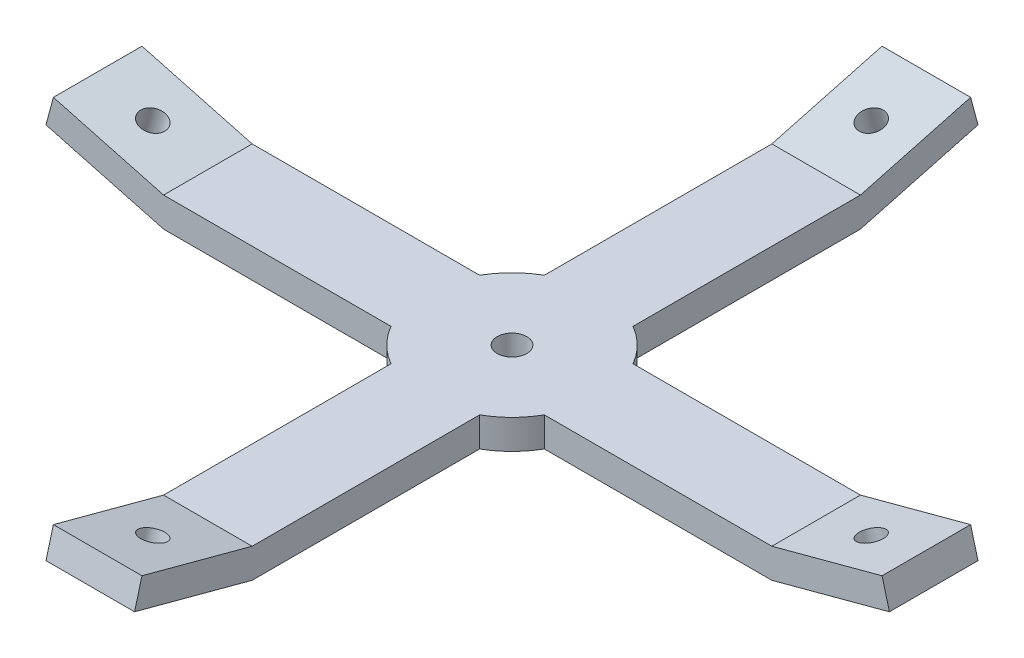
ISO-10303-21;
HEADER;
FILE_DESCRIPTION(('STEP AP214'),'2;1');
FILE_NAME('part.step','',(''),(''),'','','');
FILE_SCHEMA(('AUTOMOTIVE_DESIGN { 1 0 10303 214 1 1 1 1 }'));
ENDSEC;
DATA;
#1=APPLICATION_CONTEXT('core data for automotive mechanical design processes');
#2=APPLICATION_PROTOCOL_DEFINITION('international standard','automotive_design',2000,#1);
#3=PRODUCT_CONTEXT('',#1,'mechanical');
#4=PRODUCT('Part','Part','',(#3));
#5=PRODUCT_RELATED_PRODUCT_CATEGORY('part','',(#4));
#6=PRODUCT_DEFINITION_FORMATION('','',#4);
#7=PRODUCT_DEFINITION_CONTEXT('part definition',#1,'design');
#8=PRODUCT_DEFINITION('design','',#6,#7);
#9=PRODUCT_DEFINITION_SHAPE('','',#8);
#10=(LENGTH_UNIT() NAMED_UNIT(*) SI_UNIT(.MILLI.,.METRE.));
#11=(NAMED_UNIT(*) PLANE_ANGLE_UNIT() SI_UNIT($,.RADIAN.));
#12=(NAMED_UNIT(*) SI_UNIT($,.STERADIAN.) SOLID_ANGLE_UNIT());
#13=UNCERTAINTY_MEASURE_WITH_UNIT(LENGTH_MEASURE(1.E-05),#10,'distance_accuracy_value','');
#14=(GEOMETRIC_REPRESENTATION_CONTEXT(3) GLOBAL_UNCERTAINTY_ASSIGNED_CONTEXT((#13)) GLOBAL_UNIT_ASSIGNED_CONTEXT((#10,
#11,#12)) REPRESENTATION_CONTEXT('',''));
#15=CARTESIAN_POINT('',(0.,0.,0.));
#16=DIRECTION('',(0.,0.,1.));
#17=DIRECTION('',(1.,0.,0.));
#18=AXIS2_PLACEMENT_3D('',#15,#16,#17);
#19=CARTESIAN_POINT('',(-7.5,5.,-51.5));
#20=DIRECTION('',(1.,0.,0.));
#21=DIRECTION('',(0.,0.,-1.));
#22=AXIS2_PLACEMENT_3D('',#19,#20,#21);
#23=PLANE('',#22);
#24=DIRECTION('',(0.,0.,1.));
#25=VECTOR('',#24,1.);
#26=CARTESIAN_POINT('',(-7.5,0.,-51.5));
#27=LINE('',#26,#25);
#28=CARTESIAN_POINT('',(-7.5,0.,-51.5));
#29=VERTEX_POINT('',#28);
#30=CARTESIAN_POINT('',(-7.49999999999999,0.,-12.9903810567666));
#31=VERTEX_POINT('',#30);
#32=EDGE_CURVE('E101',#29,#31,#27,.T.);
#33=ORIENTED_EDGE('',*,*,#32,.T.);
#34=DIRECTION('',(0.,-1.,0.));
#35=VECTOR('',#34,1.);
#36=CARTESIAN_POINT('',(-7.49999999999999,5.,-12.9903810567666));
#37=LINE('',#36,#35);
#38=CARTESIAN_POINT('',(-7.49999999999999,5.,-12.9903810567666));
#39=VERTEX_POINT('',#38);
#40=EDGE_CURVE('E11',#39,#31,#37,.T.);
#41=ORIENTED_EDGE('',*,*,#40,.F.);
#42=DIRECTION('',(0.,0.,1.));
#43=VECTOR('',#42,1.);
#44=CARTESIAN_POINT('',(-7.5,5.,-51.5));
#45=LINE('',#44,#43);
#46=CARTESIAN_POINT('',(-7.5,5.,-51.5));
#47=VERTEX_POINT('',#46);
#48=EDGE_CURVE('E209',#47,#39,#45,.T.);
#49=ORIENTED_EDGE('',*,*,#48,.F.);
#50=DIRECTION('',(0.,0.258819045102515,-0.96592582628907));
#51=VECTOR('',#50,1.);
#52=CARTESIAN_POINT('',(-7.50000000000001,10.,-70.1602540378449));
#53=LINE('',#52,#51);
#54=CARTESIAN_POINT('',(-7.50000000000001,10.,-70.1602540378449));
#55=VERTEX_POINT('',#54);
#56=EDGE_CURVE('E267',#47,#55,#53,.T.);
#57=ORIENTED_EDGE('',*,*,#56,.T.);
#58=DIRECTION('',(0.,-0.965925826289068,-0.25881904510252));
#59=VECTOR('',#58,1.);
#60=CARTESIAN_POINT('',(-7.50000000000001,10.,-70.1602540378449));
#61=LINE('',#60,#59);
#62=CARTESIAN_POINT('',(-7.50000000000001,5.33493649053889,-71.4102540378449));
#63=VERTEX_POINT('',#62);
#64=EDGE_CURVE('E282',#55,#63,#61,.T.);
#65=ORIENTED_EDGE('',*,*,#64,.T.);
#66=DIRECTION('',(0.,-0.258819045102514,0.96592582628907));
#67=VECTOR('',#66,1.);
#68=CARTESIAN_POINT('',(-7.5,0.,-51.5));
#69=LINE('',#68,#67);
#70=EDGE_CURVE('E273',#63,#29,#69,.T.);
#71=ORIENTED_EDGE('',*,*,#70,.T.);
#72=EDGE_LOOP('',(#33,#41,#49,#57,#65,#71));
#73=FACE_BOUND('',#72,.T.);
#74=ADVANCED_FACE('F35',(#73),#23,.F.);
#75=CARTESIAN_POINT('',(0.,5.,0.));
#76=DIRECTION('',(0.,-1.,0.));
#77=DIRECTION('',(0.,0.,-1.));
#78=AXIS2_PLACEMENT_3D('',#75,#76,#77);
#79=CYLINDRICAL_SURFACE('',#78,15.);
#80=CARTESIAN_POINT('',(0.,0.,0.));
#81=DIRECTION('',(0.,1.,0.));
#82=DIRECTION('',(0.,0.,1.));
#83=AXIS2_PLACEMENT_3D('',#80,#81,#82);
#84=CIRCLE('',#83,15.);
#85=CARTESIAN_POINT('',(-12.9903810567666,0.,-7.49999999999993));
#86=VERTEX_POINT('',#85);
#87=EDGE_CURVE('E174',#31,#86,#84,.T.);
#88=ORIENTED_EDGE('',*,*,#87,.T.);
#89=DIRECTION('',(0.,-1.,0.));
#90=VECTOR('',#89,1.);
#91=CARTESIAN_POINT('',(-12.9903810567666,5.,-7.49999999999993));
#92=LINE('',#91,#90);
#93=CARTESIAN_POINT('',(-12.9903810567666,5.,-7.49999999999993));
#94=VERTEX_POINT('',#93);
#95=EDGE_CURVE('E44',#94,#86,#92,.T.);
#96=ORIENTED_EDGE('',*,*,#95,.F.);
#97=CARTESIAN_POINT('',(0.,5.,0.));
#98=DIRECTION('',(0.,1.,0.));
#99=DIRECTION('',(0.,0.,1.));
#100=AXIS2_PLACEMENT_3D('',#97,#98,#99);
#101=CIRCLE('',#100,15.);
#102=EDGE_CURVE('E109',#39,#94,#101,.T.);
#103=ORIENTED_EDGE('',*,*,#102,.F.);
#104=ORIENTED_EDGE('',*,*,#40,.T.);
#105=EDGE_LOOP('',(#88,#96,#103,#104));
#106=FACE_BOUND('',#105,.T.);
#107=ADVANCED_FACE('F467',(#106),#79,.T.);
#108=CARTESIAN_POINT('',(-51.5,5.,-7.49999999999981));
#109=DIRECTION('',(0.,0.,1.));
#110=DIRECTION('',(1.,0.,0.));
#111=AXIS2_PLACEMENT_3D('',#108,#109,#110);
#112=PLANE('',#111);
#113=DIRECTION('',(-1.,0.,0.));
#114=VECTOR('',#113,1.);
#115=CARTESIAN_POINT('',(-51.5,0.,-7.49999999999981));
#116=LINE('',#115,#114);
#117=CARTESIAN_POINT('',(-51.5,0.,-7.50000000000002));
#118=VERTEX_POINT('',#117);
#119=EDGE_CURVE('E177',#86,#118,#116,.T.);
#120=ORIENTED_EDGE('',*,*,#119,.T.);
#121=DIRECTION('',(0.96592582628907,-0.258819045102514,0.));
#122=VECTOR('',#121,1.);
#123=CARTESIAN_POINT('',(-51.5,0.,-7.50000000000002));
#124=LINE('',#123,#122);
#125=CARTESIAN_POINT('',(-71.4102540378449,5.33493649053889,-7.50000000000002));
#126=VERTEX_POINT('',#125);
#127=EDGE_CURVE('E247',#126,#118,#124,.T.);
#128=ORIENTED_EDGE('',*,*,#127,.F.);
#129=DIRECTION('',(-0.258819045102515,-0.96592582628907,0.));
#130=VECTOR('',#129,1.);
#131=CARTESIAN_POINT('',(-70.1602540378449,10.,-7.50000000000002));
#132=LINE('',#131,#130);
#133=CARTESIAN_POINT('',(-70.1602540378449,10.,-7.50000000000002));
#134=VERTEX_POINT('',#133);
#135=EDGE_CURVE('E258',#134,#126,#132,.T.);
#136=ORIENTED_EDGE('',*,*,#135,.F.);
#137=DIRECTION('',(-0.96592582628907,0.258819045102514,0.));
#138=VECTOR('',#137,1.);
#139=CARTESIAN_POINT('',(-70.1602540378449,10.,-7.50000000000002));
#140=LINE('',#139,#138);
#141=CARTESIAN_POINT('',(-51.5,5.,-7.49999999999981));
#142=VERTEX_POINT('',#141);
#143=EDGE_CURVE('E255',#142,#134,#140,.T.);
#144=ORIENTED_EDGE('',*,*,#143,.F.);
#145=DIRECTION('',(-1.,0.,0.));
#146=VECTOR('',#145,1.);
#147=CARTESIAN_POINT('',(-51.5,5.,-7.49999999999981));
#148=LINE('',#147,#146);
#149=EDGE_CURVE('E233',#94,#142,#148,.T.);
#150=ORIENTED_EDGE('',*,*,#149,.F.);
#151=ORIENTED_EDGE('',*,*,#95,.T.);
#152=EDGE_LOOP('',(#120,#128,#136,#144,#150,#151));
#153=FACE_BOUND('',#152,.T.);
#154=ADVANCED_FACE('F228',(#153),#112,.F.);
#155=CARTESIAN_POINT('',(-51.5,5.,7.50000000000019));
#156=DIRECTION('',(0.,0.,-1.));
#157=DIRECTION('',(-1.,0.,0.));
#158=AXIS2_PLACEMENT_3D('',#155,#156,#157);
#159=PLANE('',#158);
#160=DIRECTION('',(1.,0.,0.));
#161=VECTOR('',#160,1.);
#162=CARTESIAN_POINT('',(-51.5,0.,7.50000000000019));
#163=LINE('',#162,#161);
#164=CARTESIAN_POINT('',(-51.5,0.,7.50000000000019));
#165=VERTEX_POINT('',#164);
#166=CARTESIAN_POINT('',(-12.9903810567666,0.,7.50000000000004));
#167=VERTEX_POINT('',#166);
#168=EDGE_CURVE('E183',#165,#167,#163,.T.);
#169=ORIENTED_EDGE('',*,*,#168,.T.);
#170=DIRECTION('',(0.,-1.,0.));
#171=VECTOR('',#170,1.);
#172=CARTESIAN_POINT('',(-12.9903810567666,5.,7.50000000000004));
#173=LINE('',#172,#171);
#174=CARTESIAN_POINT('',(-12.9903810567666,5.,7.50000000000004));
#175=VERTEX_POINT('',#174);
#176=EDGE_CURVE('E221',#175,#167,#173,.T.);
#177=ORIENTED_EDGE('',*,*,#176,.F.);
#178=DIRECTION('',(1.,0.,0.));
#179=VECTOR('',#178,1.);
#180=CARTESIAN_POINT('',(-51.5,5.,7.50000000000019));
#181=LINE('',#180,#179);
#182=CARTESIAN_POINT('',(-51.5,5.,7.50000000000019));
#183=VERTEX_POINT('',#182);
#184=EDGE_CURVE('E344',#183,#175,#181,.T.);
#185=ORIENTED_EDGE('',*,*,#184,.F.);
#186=DIRECTION('',(-0.96592582628907,0.258819045102514,0.));
#187=VECTOR('',#186,1.);
#188=CARTESIAN_POINT('',(-70.1602540378449,10.,7.49999999999998));
#189=LINE('',#188,#187);
#190=CARTESIAN_POINT('',(-70.1602540378449,10.,7.49999999999998));
#191=VERTEX_POINT('',#190);
#192=EDGE_CURVE('E260',#183,#191,#189,.T.);
#193=ORIENTED_EDGE('',*,*,#192,.T.);
#194=DIRECTION('',(-0.258819045102515,-0.96592582628907,0.));
#195=VECTOR('',#194,1.);
#196=CARTESIAN_POINT('',(-70.1602540378449,10.,7.49999999999998));
#197=LINE('',#196,#195);
#198=CARTESIAN_POINT('',(-71.4102540378449,5.33493649053889,7.49999999999998));
#199=VERTEX_POINT('',#198);
#200=EDGE_CURVE('E254',#191,#199,#197,.T.);
#201=ORIENTED_EDGE('',*,*,#200,.T.);
#202=DIRECTION('',(0.96592582628907,-0.258819045102514,0.));
#203=VECTOR('',#202,1.);
#204=CARTESIAN_POINT('',(-51.5,0.,7.49999999999998));
#205=LINE('',#204,#203);
#206=EDGE_CURVE('E246',#199,#165,#205,.T.);
#207=ORIENTED_EDGE('',*,*,#206,.T.);
#208=EDGE_LOOP('',(#169,#177,#185,#193,#201,#207));
#209=FACE_BOUND('',#208,.T.);
#210=ADVANCED_FACE('F250',(#209),#159,.F.);
#211=CARTESIAN_POINT('',(0.,5.,0.));
#212=DIRECTION('',(0.,-1.,0.));
#213=DIRECTION('',(0.,0.,-1.));
#214=AXIS2_PLACEMENT_3D('',#211,#212,#213);
#215=CYLINDRICAL_SURFACE('',#214,15.);
#216=CARTESIAN_POINT('',(0.,0.,0.));
#217=DIRECTION('',(0.,1.,0.));
#218=DIRECTION('',(0.,0.,1.));
#219=AXIS2_PLACEMENT_3D('',#216,#217,#218);
#220=CIRCLE('',#219,15.);
#221=CARTESIAN_POINT('',(-7.49999999999999,0.,12.9903810567666));
#222=VERTEX_POINT('',#221);
#223=EDGE_CURVE('E185',#167,#222,#220,.T.);
#224=ORIENTED_EDGE('',*,*,#223,.T.);
#225=DIRECTION('',(0.,-1.,0.));
#226=VECTOR('',#225,1.);
#227=CARTESIAN_POINT('',(-7.49999999999999,5.,12.9903810567666));
#228=LINE('',#227,#226);
#229=CARTESIAN_POINT('',(-7.49999999999999,5.,12.9903810567666));
#230=VERTEX_POINT('',#229);
#231=EDGE_CURVE('E218',#230,#222,#228,.T.);
#232=ORIENTED_EDGE('',*,*,#231,.F.);
#233=CARTESIAN_POINT('',(0.,5.,0.));
#234=DIRECTION('',(0.,1.,0.));
#235=DIRECTION('',(0.,0.,1.));
#236=AXIS2_PLACEMENT_3D('',#233,#234,#235);
#237=CIRCLE('',#236,15.);
#238=EDGE_CURVE('E346',#175,#230,#237,.T.);
#239=ORIENTED_EDGE('',*,*,#238,.F.);
#240=ORIENTED_EDGE('',*,*,#176,.T.);
#241=EDGE_LOOP('',(#224,#232,#239,#240));
#242=FACE_BOUND('',#241,.T.);
#243=ADVANCED_FACE('F451',(#242),#215,.T.);
#244=CARTESIAN_POINT('',(-7.49999999999999,5.,12.9903810567666));
#245=DIRECTION('',(1.,0.,0.));
#246=DIRECTION('',(0.,0.,-1.));
#247=AXIS2_PLACEMENT_3D('',#244,#245,#246);
#248=PLANE('',#247);
#249=DIRECTION('',(0.,0.,1.));
#250=VECTOR('',#249,1.);
#251=CARTESIAN_POINT('',(-7.49999999999999,0.,12.9903810567666));
#252=LINE('',#251,#250);
#253=CARTESIAN_POINT('',(-7.50000000000001,0.,51.5));
#254=VERTEX_POINT('',#253);
#255=EDGE_CURVE('E187',#222,#254,#252,.T.);
#256=ORIENTED_EDGE('',*,*,#255,.T.);
#257=DIRECTION('',(0.,-0.258819045102514,-0.96592582628907));
#258=VECTOR('',#257,1.);
#259=CARTESIAN_POINT('',(-7.50000000000001,0.,51.5));
#260=LINE('',#259,#258);
#261=CARTESIAN_POINT('',(-7.50000000000001,5.33493649053889,71.4102540378449));
#262=VERTEX_POINT('',#261);
#263=EDGE_CURVE('E324',#262,#254,#260,.T.);
#264=ORIENTED_EDGE('',*,*,#263,.F.);
#265=DIRECTION('',(0.,-0.965925826289071,0.258819045102512));
#266=VECTOR('',#265,1.);
#267=CARTESIAN_POINT('',(-7.50000000000001,10.,70.1602540378449));
#268=LINE('',#267,#266);
#269=CARTESIAN_POINT('',(-7.50000000000001,10.,70.1602540378449));
#270=VERTEX_POINT('',#269);
#271=EDGE_CURVE('E320',#270,#262,#268,.T.);
#272=ORIENTED_EDGE('',*,*,#271,.F.);
#273=DIRECTION('',(0.,0.258819045102514,0.96592582628907));
#274=VECTOR('',#273,1.);
#275=CARTESIAN_POINT('',(-7.50000000000001,10.,70.1602540378449));
#276=LINE('',#275,#274);
#277=CARTESIAN_POINT('',(-7.49999999999999,5.,51.5));
#278=VERTEX_POINT('',#277);
#279=EDGE_CURVE('E317',#278,#270,#276,.T.);
#280=ORIENTED_EDGE('',*,*,#279,.F.);
#281=DIRECTION('',(0.,0.,1.));
#282=VECTOR('',#281,1.);
#283=CARTESIAN_POINT('',(-7.49999999999999,5.,12.9903810567666));
#284=LINE('',#283,#282);
#285=EDGE_CURVE('E348',#230,#278,#284,.T.);
#286=ORIENTED_EDGE('',*,*,#285,.F.);
#287=ORIENTED_EDGE('',*,*,#231,.T.);
#288=EDGE_LOOP('',(#256,#264,#272,#280,#286,#287));
#289=FACE_BOUND('',#288,.T.);
#290=ADVANCED_FACE('F457',(#289),#248,.F.);
#291=CARTESIAN_POINT('',(7.49999999999999,5.,12.9903810567666));
#292=DIRECTION('',(-1.,0.,0.));
#293=DIRECTION('',(0.,0.,1.));
#294=AXIS2_PLACEMENT_3D('',#291,#292,#293);
#295=PLANE('',#294);
#296=DIRECTION('',(0.,0.,-1.));
#297=VECTOR('',#296,1.);
#298=CARTESIAN_POINT('',(7.49999999999999,0.,12.9903810567666));
#299=LINE('',#298,#297);
#300=CARTESIAN_POINT('',(7.49999999999999,0.,51.5));
#301=VERTEX_POINT('',#300);
#302=CARTESIAN_POINT('',(7.49999999999999,0.,12.9903810567666));
#303=VERTEX_POINT('',#302);
#304=EDGE_CURVE('E193',#301,#303,#299,.T.);
#305=ORIENTED_EDGE('',*,*,#304,.T.);
#306=DIRECTION('',(0.,-1.,0.));
#307=VECTOR('',#306,1.);
#308=CARTESIAN_POINT('',(7.49999999999999,5.,12.9903810567666));
#309=LINE('',#308,#307);
#310=CARTESIAN_POINT('',(7.49999999999999,5.,12.9903810567666));
#311=VERTEX_POINT('',#310);
#312=EDGE_CURVE('E215',#311,#303,#309,.T.);
#313=ORIENTED_EDGE('',*,*,#312,.F.);
#314=DIRECTION('',(0.,0.,-1.));
#315=VECTOR('',#314,1.);
#316=CARTESIAN_POINT('',(7.49999999999999,5.,12.9903810567666));
#317=LINE('',#316,#315);
#318=CARTESIAN_POINT('',(7.49999999999999,5.,51.5));
#319=VERTEX_POINT('',#318);
#320=EDGE_CURVE('E352',#319,#311,#317,.T.);
#321=ORIENTED_EDGE('',*,*,#320,.F.);
#322=DIRECTION('',(0.,0.258819045102514,0.96592582628907));
#323=VECTOR('',#322,1.);
#324=CARTESIAN_POINT('',(7.49999999999999,10.,70.1602540378449));
#325=LINE('',#324,#323);
#326=CARTESIAN_POINT('',(7.49999999999999,10.,70.1602540378449));
#327=VERTEX_POINT('',#326);
#328=EDGE_CURVE('E314',#319,#327,#325,.T.);
#329=ORIENTED_EDGE('',*,*,#328,.T.);
#330=DIRECTION('',(0.,-0.965925826289071,0.258819045102512));
#331=VECTOR('',#330,1.);
#332=CARTESIAN_POINT('',(7.49999999999999,10.,70.1602540378449));
#333=LINE('',#332,#331);
#334=CARTESIAN_POINT('',(7.49999999999999,5.33493649053889,71.4102540378449));
#335=VERTEX_POINT('',#334);
#336=EDGE_CURVE('E330',#327,#335,#333,.T.);
#337=ORIENTED_EDGE('',*,*,#336,.T.);
#338=DIRECTION('',(0.,-0.258819045102514,-0.96592582628907));
#339=VECTOR('',#338,1.);
#340=CARTESIAN_POINT('',(7.49999999999999,0.,51.5));
#341=LINE('',#340,#339);
#342=EDGE_CURVE('E321',#335,#301,#341,.T.);
#343=ORIENTED_EDGE('',*,*,#342,.T.);
#344=EDGE_LOOP('',(#305,#313,#321,#329,#337,#343));
#345=FACE_BOUND('',#344,.T.);
#346=ADVANCED_FACE('F405',(#345),#295,.F.);
#347=CARTESIAN_POINT('',(0.,5.,0.));
#348=DIRECTION('',(0.,-1.,0.));
#349=DIRECTION('',(0.,0.,-1.));
#350=AXIS2_PLACEMENT_3D('',#347,#348,#349);
#351=CYLINDRICAL_SURFACE('',#350,15.);
#352=CARTESIAN_POINT('',(0.,0.,0.));
#353=DIRECTION('',(0.,1.,0.));
#354=DIRECTION('',(0.,0.,1.));
#355=AXIS2_PLACEMENT_3D('',#352,#353,#354);
#356=CIRCLE('',#355,15.);
#357=CARTESIAN_POINT('',(12.9903810567666,0.,7.50000000000004));
#358=VERTEX_POINT('',#357);
#359=EDGE_CURVE('E195',#303,#358,#356,.T.);
#360=ORIENTED_EDGE('',*,*,#359,.T.);
#361=DIRECTION('',(0.,-1.,0.));
#362=VECTOR('',#361,1.);
#363=CARTESIAN_POINT('',(12.9903810567666,5.,7.50000000000004));
#364=LINE('',#363,#362);
#365=CARTESIAN_POINT('',(12.9903810567666,5.,7.50000000000004));
#366=VERTEX_POINT('',#365);
#367=EDGE_CURVE('E212',#366,#358,#364,.T.);
#368=ORIENTED_EDGE('',*,*,#367,.F.);
#369=CARTESIAN_POINT('',(0.,5.,0.));
#370=DIRECTION('',(0.,1.,0.));
#371=DIRECTION('',(0.,0.,1.));
#372=AXIS2_PLACEMENT_3D('',#369,#370,#371);
#373=CIRCLE('',#372,15.);
#374=EDGE_CURVE('E354',#311,#366,#373,.T.);
#375=ORIENTED_EDGE('',*,*,#374,.F.);
#376=ORIENTED_EDGE('',*,*,#312,.T.);
#377=EDGE_LOOP('',(#360,#368,#375,#376));
#378=FACE_BOUND('',#377,.T.);
#379=ADVANCED_FACE('F395',(#378),#351,.T.);
#380=CARTESIAN_POINT('',(51.5,5.,7.50000000000018));
#381=DIRECTION('',(0.,0.,-1.));
#382=DIRECTION('',(-1.,0.,0.));
#383=AXIS2_PLACEMENT_3D('',#380,#381,#382);
#384=PLANE('',#383);
#385=DIRECTION('',(1.,0.,0.));
#386=VECTOR('',#385,1.);
#387=CARTESIAN_POINT('',(51.5,0.,7.50000000000018));
#388=LINE('',#387,#386);
#389=CARTESIAN_POINT('',(51.5,0.,7.50000000000018));
#390=VERTEX_POINT('',#389);
#391=EDGE_CURVE('E197',#358,#390,#388,.T.);
#392=ORIENTED_EDGE('',*,*,#391,.T.);
#393=DIRECTION('',(-0.96592582628907,-0.258819045102514,0.));
#394=VECTOR('',#393,1.);
#395=CARTESIAN_POINT('',(51.5,0.,7.50000000000018));
#396=LINE('',#395,#394);
#397=CARTESIAN_POINT('',(71.4102540378449,5.3349364905389,7.50000000000025));
#398=VERTEX_POINT('',#397);
#399=EDGE_CURVE('E300',#398,#390,#396,.T.);
#400=ORIENTED_EDGE('',*,*,#399,.F.);
#401=DIRECTION('',(0.258819045102515,-0.96592582628907,0.));
#402=VECTOR('',#401,1.);
#403=CARTESIAN_POINT('',(70.1602540378449,10.,7.50000000000025));
#404=LINE('',#403,#402);
#405=CARTESIAN_POINT('',(70.1602540378449,10.,7.50000000000025));
#406=VERTEX_POINT('',#405);
#407=EDGE_CURVE('E296',#406,#398,#404,.T.);
#408=ORIENTED_EDGE('',*,*,#407,.F.);
#409=DIRECTION('',(0.96592582628907,0.258819045102514,0.));
#410=VECTOR('',#409,1.);
#411=CARTESIAN_POINT('',(70.1602540378449,10.,7.50000000000025));
#412=LINE('',#411,#410);
#413=CARTESIAN_POINT('',(51.5,5.,7.50000000000018));
#414=VERTEX_POINT('',#413);
#415=EDGE_CURVE('E293',#414,#406,#412,.T.);
#416=ORIENTED_EDGE('',*,*,#415,.F.);
#417=DIRECTION('',(1.,0.,0.));
#418=VECTOR('',#417,1.);
#419=CARTESIAN_POINT('',(51.5,5.,7.50000000000018));
#420=LINE('',#419,#418);
#421=EDGE_CURVE('E356',#366,#414,#420,.T.);
#422=ORIENTED_EDGE('',*,*,#421,.F.);
#423=ORIENTED_EDGE('',*,*,#367,.T.);
#424=EDGE_LOOP('',(#392,#400,#408,#416,#422,#423));
#425=FACE_BOUND('',#424,.T.);
#426=ADVANCED_FACE('F391',(#425),#384,.F.);
#427=CARTESIAN_POINT('',(51.5,5.,-7.49999999999982));
#428=DIRECTION('',(0.,0.,1.));
#429=DIRECTION('',(1.,0.,0.));
#430=AXIS2_PLACEMENT_3D('',#427,#428,#429);
#431=PLANE('',#430);
#432=DIRECTION('',(-1.,0.,0.));
#433=VECTOR('',#432,1.);
#434=CARTESIAN_POINT('',(51.5,0.,-7.49999999999982));
#435=LINE('',#434,#433);
#436=CARTESIAN_POINT('',(51.5,0.,-7.49999999999982));
#437=VERTEX_POINT('',#436);
#438=CARTESIAN_POINT('',(12.9903810567666,0.,-7.49999999999996));
#439=VERTEX_POINT('',#438);
#440=EDGE_CURVE('E203',#437,#439,#435,.T.);
#441=ORIENTED_EDGE('',*,*,#440,.T.);
#442=DIRECTION('',(0.,-1.,0.));
#443=VECTOR('',#442,1.);
#444=CARTESIAN_POINT('',(12.9903810567666,5.,-7.49999999999996));
#445=LINE('',#444,#443);
#446=CARTESIAN_POINT('',(12.9903810567666,5.,-7.49999999999996));
#447=VERTEX_POINT('',#446);
#448=EDGE_CURVE('E162',#447,#439,#445,.T.);
#449=ORIENTED_EDGE('',*,*,#448,.F.);
#450=DIRECTION('',(-1.,0.,0.));
#451=VECTOR('',#450,1.);
#452=CARTESIAN_POINT('',(51.5,5.,-7.49999999999982));
#453=LINE('',#452,#451);
#454=CARTESIAN_POINT('',(51.5,5.,-7.49999999999982));
#455=VERTEX_POINT('',#454);
#456=EDGE_CURVE('E154',#455,#447,#453,.T.);
#457=ORIENTED_EDGE('',*,*,#456,.F.);
#458=DIRECTION('',(0.96592582628907,0.258819045102514,0.));
#459=VECTOR('',#458,1.);
#460=CARTESIAN_POINT('',(70.160254037845,10.,-7.49999999999975));
#461=LINE('',#460,#459);
#462=CARTESIAN_POINT('',(70.160254037845,10.,-7.49999999999975));
#463=VERTEX_POINT('',#462);
#464=EDGE_CURVE('E290',#455,#463,#461,.T.);
#465=ORIENTED_EDGE('',*,*,#464,.T.);
#466=DIRECTION('',(0.258819045102515,-0.96592582628907,0.));
#467=VECTOR('',#466,1.);
#468=CARTESIAN_POINT('',(70.160254037845,10.,-7.49999999999975));
#469=LINE('',#468,#467);
#470=CARTESIAN_POINT('',(71.4102540378449,5.3349364905389,-7.49999999999975));
#471=VERTEX_POINT('',#470);
#472=EDGE_CURVE('E306',#463,#471,#469,.T.);
#473=ORIENTED_EDGE('',*,*,#472,.T.);
#474=DIRECTION('',(-0.96592582628907,-0.258819045102514,0.));
#475=VECTOR('',#474,1.);
#476=CARTESIAN_POINT('',(51.5,0.,-7.49999999999982));
#477=LINE('',#476,#475);
#478=EDGE_CURVE('E297',#471,#437,#477,.T.);
#479=ORIENTED_EDGE('',*,*,#478,.T.);
#480=EDGE_LOOP('',(#441,#449,#457,#465,#473,#479));
#481=FACE_BOUND('',#480,.T.);
#482=ADVANCED_FACE('F365',(#481),#431,.F.);
#483=CARTESIAN_POINT('',(0.,5.,0.));
#484=DIRECTION('',(0.,-1.,0.));
#485=DIRECTION('',(0.,0.,-1.));
#486=AXIS2_PLACEMENT_3D('',#483,#484,#485);
#487=CYLINDRICAL_SURFACE('',#486,15.);
#488=CARTESIAN_POINT('',(0.,0.,0.));
#489=DIRECTION('',(0.,1.,0.));
#490=DIRECTION('',(0.,0.,1.));
#491=AXIS2_PLACEMENT_3D('',#488,#489,#490);
#492=CIRCLE('',#491,15.);
#493=CARTESIAN_POINT('',(7.5,0.,-12.9903810567666));
#494=VERTEX_POINT('',#493);
#495=EDGE_CURVE('E94',#439,#494,#492,.T.);
#496=ORIENTED_EDGE('',*,*,#495,.T.);
#497=DIRECTION('',(0.,-1.,0.));
#498=VECTOR('',#497,1.);
#499=CARTESIAN_POINT('',(7.5,5.,-12.9903810567666));
#500=LINE('',#499,#498);
#501=CARTESIAN_POINT('',(7.5,5.,-12.9903810567666));
#502=VERTEX_POINT('',#501);
#503=EDGE_CURVE('E157',#502,#494,#500,.T.);
#504=ORIENTED_EDGE('',*,*,#503,.F.);
#505=CARTESIAN_POINT('',(0.,5.,0.));
#506=DIRECTION('',(0.,1.,0.));
#507=DIRECTION('',(0.,0.,1.));
#508=AXIS2_PLACEMENT_3D('',#505,#506,#507);
#509=CIRCLE('',#508,15.);
#510=EDGE_CURVE('E149',#447,#502,#509,.T.);
#511=ORIENTED_EDGE('',*,*,#510,.F.);
#512=ORIENTED_EDGE('',*,*,#448,.T.);
#513=EDGE_LOOP('',(#496,#504,#511,#512));
#514=FACE_BOUND('',#513,.T.);
#515=ADVANCED_FACE('F158',(#514),#487,.T.);
#516=CARTESIAN_POINT('',(7.5,5.,-51.5));
#517=DIRECTION('',(-1.,0.,0.));
#518=DIRECTION('',(0.,0.,1.));
#519=AXIS2_PLACEMENT_3D('',#516,#517,#518);
#520=PLANE('',#519);
#521=DIRECTION('',(0.,0.,-1.));
#522=VECTOR('',#521,1.);
#523=CARTESIAN_POINT('',(7.5,0.,-51.5));
#524=LINE('',#523,#522);
#525=CARTESIAN_POINT('',(7.5,0.,-51.5));
#526=VERTEX_POINT('',#525);
#527=EDGE_CURVE('E206',#494,#526,#524,.T.);
#528=ORIENTED_EDGE('',*,*,#527,.T.);
#529=DIRECTION('',(0.,-0.258819045102514,0.96592582628907));
#530=VECTOR('',#529,1.);
#531=CARTESIAN_POINT('',(7.5,0.,-51.5));
#532=LINE('',#531,#530);
#533=CARTESIAN_POINT('',(7.49999999999999,5.33493649053889,-71.4102540378449));
#534=VERTEX_POINT('',#533);
#535=EDGE_CURVE('E276',#534,#526,#532,.T.);
#536=ORIENTED_EDGE('',*,*,#535,.F.);
#537=DIRECTION('',(0.,-0.965925826289068,-0.25881904510252));
#538=VECTOR('',#537,1.);
#539=CARTESIAN_POINT('',(7.49999999999999,10.,-70.1602540378449));
#540=LINE('',#539,#538);
#541=CARTESIAN_POINT('',(7.49999999999999,10.,-70.1602540378449));
#542=VERTEX_POINT('',#541);
#543=EDGE_CURVE('E272',#542,#534,#540,.T.);
#544=ORIENTED_EDGE('',*,*,#543,.F.);
#545=DIRECTION('',(0.,0.258819045102515,-0.96592582628907));
#546=VECTOR('',#545,1.);
#547=CARTESIAN_POINT('',(7.49999999999999,10.,-70.1602540378449));
#548=LINE('',#547,#546);
#549=CARTESIAN_POINT('',(7.5,5.,-51.5));
#550=VERTEX_POINT('',#549);
#551=EDGE_CURVE('E168',#550,#542,#548,.T.);
#552=ORIENTED_EDGE('',*,*,#551,.F.);
#553=DIRECTION('',(0.,0.,-1.));
#554=VECTOR('',#553,1.);
#555=CARTESIAN_POINT('',(7.5,5.,-51.5));
#556=LINE('',#555,#554);
#557=EDGE_CURVE('E152',#502,#550,#556,.T.);
#558=ORIENTED_EDGE('',*,*,#557,.F.);
#559=ORIENTED_EDGE('',*,*,#503,.T.);
#560=EDGE_LOOP('',(#528,#536,#544,#552,#558,#559));
#561=FACE_BOUND('',#560,.T.);
#562=ADVANCED_FACE('F165',(#561),#520,.F.);
#563=CARTESIAN_POINT('',(0.,5.,0.));
#564=DIRECTION('',(0.,1.,0.));
#565=DIRECTION('',(0.,0.,1.));
#566=AXIS2_PLACEMENT_3D('',#563,#564,#565);
#567=PLANE('',#566);
#568=CARTESIAN_POINT('',(0.,5.,0.));
#569=DIRECTION('',(0.,1.,0.));
#570=DIRECTION('',(0.,0.,1.));
#571=AXIS2_PLACEMENT_3D('',#568,#569,#570);
#572=CIRCLE('',#571,2.49999999999999);
#573=CARTESIAN_POINT('',(0.,5.,2.49999999999999));
#574=VERTEX_POINT('',#573);
#575=EDGE_CURVE('E773',#574,#574,#572,.T.);
#576=ORIENTED_EDGE('',*,*,#575,.F.);
#577=EDGE_LOOP('',(#576));
#578=FACE_BOUND('',#577,.T.);
#579=ORIENTED_EDGE('',*,*,#48,.T.);
#580=ORIENTED_EDGE('',*,*,#102,.T.);
#581=ORIENTED_EDGE('',*,*,#149,.T.);
#582=DIRECTION('',(0.,0.,1.));
#583=VECTOR('',#582,1.);
#584=CARTESIAN_POINT('',(-51.5,5.,-7.49999999999981));
#585=LINE('',#584,#583);
#586=EDGE_CURVE('E342',#142,#183,#585,.T.);
#587=ORIENTED_EDGE('',*,*,#586,.T.);
#588=ORIENTED_EDGE('',*,*,#184,.T.);
#589=ORIENTED_EDGE('',*,*,#238,.T.);
#590=ORIENTED_EDGE('',*,*,#285,.T.);
#591=DIRECTION('',(1.,0.,0.));
#592=VECTOR('',#591,1.);
#593=CARTESIAN_POINT('',(-7.49999999999999,5.,51.5));
#594=LINE('',#593,#592);
#595=EDGE_CURVE('E350',#278,#319,#594,.T.);
#596=ORIENTED_EDGE('',*,*,#595,.T.);
#597=ORIENTED_EDGE('',*,*,#320,.T.);
#598=ORIENTED_EDGE('',*,*,#374,.T.);
#599=ORIENTED_EDGE('',*,*,#421,.T.);
#600=DIRECTION('',(0.,0.,-1.));
#601=VECTOR('',#600,1.);
#602=CARTESIAN_POINT('',(51.5,5.,-7.49999999999982));
#603=LINE('',#602,#601);
#604=EDGE_CURVE('E358',#414,#455,#603,.T.);
#605=ORIENTED_EDGE('',*,*,#604,.T.);
#606=ORIENTED_EDGE('',*,*,#456,.T.);
#607=ORIENTED_EDGE('',*,*,#510,.T.);
#608=ORIENTED_EDGE('',*,*,#557,.T.);
#609=DIRECTION('',(-1.,0.,0.));
#610=VECTOR('',#609,1.);
#611=CARTESIAN_POINT('',(-7.5,5.,-51.5));
#612=LINE('',#611,#610);
#613=EDGE_CURVE('E52',#550,#47,#612,.T.);
#614=ORIENTED_EDGE('',*,*,#613,.T.);
#615=EDGE_LOOP('',(#579,#580,#581,#587,#588,#589,#590,#596,#597,#598,#599,#605,#606,#607,#608,#614));
#616=FACE_BOUND('',#615,.T.);
#617=ADVANCED_FACE('F150',(#578,#616),#567,.T.);
#618=CARTESIAN_POINT('',(0.,0.,0.));
#619=DIRECTION('',(0.,1.,0.));
#620=DIRECTION('',(0.,0.,1.));
#621=AXIS2_PLACEMENT_3D('',#618,#619,#620);
#622=PLANE('',#621);
#623=CARTESIAN_POINT('',(0.,0.,0.));
#624=DIRECTION('',(0.,1.,0.));
#625=DIRECTION('',(0.,0.,1.));
#626=AXIS2_PLACEMENT_3D('',#623,#624,#625);
#627=CIRCLE('',#626,2.5);
#628=CARTESIAN_POINT('',(0.,0.,2.5));
#629=VERTEX_POINT('',#628);
#630=EDGE_CURVE('E770',#629,#629,#627,.T.);
#631=ORIENTED_EDGE('',*,*,#630,.T.);
#632=EDGE_LOOP('',(#631));
#633=FACE_BOUND('',#632,.T.);
#634=ORIENTED_EDGE('',*,*,#32,.F.);
#635=DIRECTION('',(-1.,0.,0.));
#636=VECTOR('',#635,1.);
#637=CARTESIAN_POINT('',(-7.5,0.,-51.5));
#638=LINE('',#637,#636);
#639=EDGE_CURVE('E208',#526,#29,#638,.T.);
#640=ORIENTED_EDGE('',*,*,#639,.F.);
#641=ORIENTED_EDGE('',*,*,#527,.F.);
#642=ORIENTED_EDGE('',*,*,#495,.F.);
#643=ORIENTED_EDGE('',*,*,#440,.F.);
#644=DIRECTION('',(0.,0.,-1.));
#645=VECTOR('',#644,1.);
#646=CARTESIAN_POINT('',(51.5,0.,-7.49999999999982));
#647=LINE('',#646,#645);
#648=EDGE_CURVE('E200',#390,#437,#647,.T.);
#649=ORIENTED_EDGE('',*,*,#648,.F.);
#650=ORIENTED_EDGE('',*,*,#391,.F.);
#651=ORIENTED_EDGE('',*,*,#359,.F.);
#652=ORIENTED_EDGE('',*,*,#304,.F.);
#653=DIRECTION('',(1.,0.,0.));
#654=VECTOR('',#653,1.);
#655=CARTESIAN_POINT('',(-7.49999999999999,0.,51.5));
#656=LINE('',#655,#654);
#657=EDGE_CURVE('E190',#254,#301,#656,.T.);
#658=ORIENTED_EDGE('',*,*,#657,.F.);
#659=ORIENTED_EDGE('',*,*,#255,.F.);
#660=ORIENTED_EDGE('',*,*,#223,.F.);
#661=ORIENTED_EDGE('',*,*,#168,.F.);
#662=DIRECTION('',(0.,0.,1.));
#663=VECTOR('',#662,1.);
#664=CARTESIAN_POINT('',(-51.5,0.,-7.49999999999981));
#665=LINE('',#664,#663);
#666=EDGE_CURVE('E180',#118,#165,#665,.T.);
#667=ORIENTED_EDGE('',*,*,#666,.F.);
#668=ORIENTED_EDGE('',*,*,#119,.F.);
#669=ORIENTED_EDGE('',*,*,#87,.F.);
#670=EDGE_LOOP('',(#634,#640,#641,#642,#643,#649,#650,#651,#652,#658,#659,#660,#661,#667,#668,#669));
#671=FACE_BOUND('',#670,.T.);
#672=ADVANCED_FACE('F235',(#633,#671),#622,.F.);
#673=CARTESIAN_POINT('',(-7.50000000000001,0.,51.5));
#674=DIRECTION('',(0.,-0.96592582628907,0.258819045102514));
#675=DIRECTION('',(0.,-0.258819045102514,-0.96592582628907));
#676=AXIS2_PLACEMENT_3D('',#673,#674,#675);
#677=PLANE('',#676);
#678=CARTESIAN_POINT('',(0.,2.83493649053889,62.0801270189224));
#679=DIRECTION('',(0.,-0.96592582628907,0.258819045102514));
#680=DIRECTION('',(0.,-0.258819045102514,-0.96592582628907));
#681=AXIS2_PLACEMENT_3D('',#678,#679,#680);
#682=CIRCLE('',#681,2.09999999999999);
#683=CARTESIAN_POINT('',(0.,3.37845648525417,64.1085712541295));
#684=VERTEX_POINT('',#683);
#685=EDGE_CURVE('E794',#684,#684,#682,.T.);
#686=ORIENTED_EDGE('',*,*,#685,.F.);
#687=EDGE_LOOP('',(#686));
#688=FACE_BOUND('',#687,.T.);
#689=ORIENTED_EDGE('',*,*,#342,.F.);
#690=DIRECTION('',(1.,0.,0.));
#691=VECTOR('',#690,1.);
#692=CARTESIAN_POINT('',(-7.50000000000001,5.33493649053889,71.4102540378449));
#693=LINE('',#692,#691);
#694=EDGE_CURVE('E175',#262,#335,#693,.T.);
#695=ORIENTED_EDGE('',*,*,#694,.F.);
#696=ORIENTED_EDGE('',*,*,#263,.T.);
#697=ORIENTED_EDGE('',*,*,#657,.T.);
#698=EDGE_LOOP('',(#689,#695,#696,#697));
#699=FACE_BOUND('',#698,.T.);
#700=ADVANCED_FACE('F402',(#688,#699),#677,.T.);
#701=CARTESIAN_POINT('',(-7.50000000000001,10.,70.1602540378449));
#702=DIRECTION('',(0.,0.258819045102512,0.965925826289071));
#703=DIRECTION('',(0.,-0.965925826289071,0.258819045102512));
#704=AXIS2_PLACEMENT_3D('',#701,#702,#703);
#705=PLANE('',#704);
#706=ORIENTED_EDGE('',*,*,#336,.F.);
#707=DIRECTION('',(1.,0.,0.));
#708=VECTOR('',#707,1.);
#709=CARTESIAN_POINT('',(-7.50000000000001,10.,70.1602540378449));
#710=LINE('',#709,#708);
#711=EDGE_CURVE('E327',#270,#327,#710,.T.);
#712=ORIENTED_EDGE('',*,*,#711,.F.);
#713=ORIENTED_EDGE('',*,*,#271,.T.);
#714=ORIENTED_EDGE('',*,*,#694,.T.);
#715=EDGE_LOOP('',(#706,#712,#713,#714));
#716=FACE_BOUND('',#715,.T.);
#717=ADVANCED_FACE('F412',(#716),#705,.T.);
#718=CARTESIAN_POINT('',(-7.50000000000001,10.,70.1602540378449));
#719=DIRECTION('',(0.,0.96592582628907,-0.258819045102514));
#720=DIRECTION('',(0.,0.258819045102514,0.96592582628907));
#721=AXIS2_PLACEMENT_3D('',#718,#719,#720);
#722=PLANE('',#721);
#723=CARTESIAN_POINT('',(0.,7.50000000000001,60.8301270189225));
#724=DIRECTION('',(0.,0.96592582628907,-0.258819045102514));
#725=DIRECTION('',(0.,0.258819045102514,0.96592582628907));
#726=AXIS2_PLACEMENT_3D('',#723,#724,#725);
#727=CIRCLE('',#726,2.09999999999999);
#728=CARTESIAN_POINT('',(0.,8.04351999471529,62.8585712541295));
#729=VERTEX_POINT('',#728);
#730=EDGE_CURVE('E797',#729,#729,#727,.T.);
#731=ORIENTED_EDGE('',*,*,#730,.F.);
#732=EDGE_LOOP('',(#731));
#733=FACE_BOUND('',#732,.T.);
#734=ORIENTED_EDGE('',*,*,#328,.F.);
#735=ORIENTED_EDGE('',*,*,#595,.F.);
#736=ORIENTED_EDGE('',*,*,#279,.T.);
#737=ORIENTED_EDGE('',*,*,#711,.T.);
#738=EDGE_LOOP('',(#734,#735,#736,#737));
#739=FACE_BOUND('',#738,.T.);
#740=ADVANCED_FACE('F456',(#733,#739),#722,.T.);
#741=CARTESIAN_POINT('',(51.5,0.,7.50000000000018));
#742=DIRECTION('',(0.258819045102514,-0.96592582628907,0.));
#743=DIRECTION('',(0.96592582628907,0.258819045102514,0.));
#744=AXIS2_PLACEMENT_3D('',#741,#742,#743);
#745=PLANE('',#744);
#746=CARTESIAN_POINT('',(62.0801270189224,2.83493649053889,2.13370987545147E-13));
#747=DIRECTION('',(0.258819045102514,-0.96592582628907,0.));
#748=DIRECTION('',(0.96592582628907,0.258819045102514,0.));
#749=AXIS2_PLACEMENT_3D('',#746,#747,#748);
#750=CIRCLE('',#749,2.09999999999999);
#751=CARTESIAN_POINT('',(64.1085712541295,3.37845648525417,2.13370987545147E-13));
#752=VERTEX_POINT('',#751);
#753=EDGE_CURVE('E788',#752,#752,#750,.T.);
#754=ORIENTED_EDGE('',*,*,#753,.F.);
#755=EDGE_LOOP('',(#754));
#756=FACE_BOUND('',#755,.T.);
#757=ORIENTED_EDGE('',*,*,#478,.F.);
#758=DIRECTION('',(0.,0.,-1.));
#759=VECTOR('',#758,1.);
#760=CARTESIAN_POINT('',(71.4102540378449,5.3349364905389,7.50000000000025));
#761=LINE('',#760,#759);
#762=EDGE_CURVE('E311',#398,#471,#761,.T.);
#763=ORIENTED_EDGE('',*,*,#762,.F.);
#764=ORIENTED_EDGE('',*,*,#399,.T.);
#765=ORIENTED_EDGE('',*,*,#648,.T.);
#766=EDGE_LOOP('',(#757,#763,#764,#765));
#767=FACE_BOUND('',#766,.T.);
#768=ADVANCED_FACE('F381',(#756,#767),#745,.T.);
#769=CARTESIAN_POINT('',(70.1602540378449,10.,7.50000000000025));
#770=DIRECTION('',(0.96592582628907,0.258819045102515,0.));
#771=DIRECTION('',(-0.258819045102515,0.96592582628907,0.));
#772=AXIS2_PLACEMENT_3D('',#769,#770,#771);
#773=PLANE('',#772);
#774=ORIENTED_EDGE('',*,*,#472,.F.);
#775=DIRECTION('',(0.,0.,-1.));
#776=VECTOR('',#775,1.);
#777=CARTESIAN_POINT('',(70.1602540378449,10.,7.50000000000025));
#778=LINE('',#777,#776);
#779=EDGE_CURVE('E303',#406,#463,#778,.T.);
#780=ORIENTED_EDGE('',*,*,#779,.F.);
#781=ORIENTED_EDGE('',*,*,#407,.T.);
#782=ORIENTED_EDGE('',*,*,#762,.T.);
#783=EDGE_LOOP('',(#774,#780,#781,#782));
#784=FACE_BOUND('',#783,.T.);
#785=ADVANCED_FACE('F376',(#784),#773,.T.);
#786=CARTESIAN_POINT('',(70.1602540378449,10.,7.50000000000025));
#787=DIRECTION('',(-0.258819045102514,0.96592582628907,0.));
#788=DIRECTION('',(-0.96592582628907,-0.258819045102514,0.));
#789=AXIS2_PLACEMENT_3D('',#786,#787,#788);
#790=PLANE('',#789);
#791=CARTESIAN_POINT('',(60.8301270189225,7.5,2.13370987545147E-13));
#792=DIRECTION('',(-0.258819045102514,0.96592582628907,0.));
#793=DIRECTION('',(-0.96592582628907,-0.258819045102514,0.));
#794=AXIS2_PLACEMENT_3D('',#791,#792,#793);
#795=CIRCLE('',#794,2.09999999999999);
#796=CARTESIAN_POINT('',(58.8016827837154,6.95648000528472,2.13370987545147E-13));
#797=VERTEX_POINT('',#796);
#798=EDGE_CURVE('E791',#797,#797,#795,.T.);
#799=ORIENTED_EDGE('',*,*,#798,.F.);
#800=EDGE_LOOP('',(#799));
#801=FACE_BOUND('',#800,.T.);
#802=ORIENTED_EDGE('',*,*,#464,.F.);
#803=ORIENTED_EDGE('',*,*,#604,.F.);
#804=ORIENTED_EDGE('',*,*,#415,.T.);
#805=ORIENTED_EDGE('',*,*,#779,.T.);
#806=EDGE_LOOP('',(#802,#803,#804,#805));
#807=FACE_BOUND('',#806,.T.);
#808=ADVANCED_FACE('F367',(#801,#807),#790,.T.);
#809=CARTESIAN_POINT('',(7.5,0.,-51.5));
#810=DIRECTION('',(0.,-0.96592582628907,-0.258819045102514));
#811=DIRECTION('',(0.,0.258819045102514,-0.96592582628907));
#812=AXIS2_PLACEMENT_3D('',#809,#810,#811);
#813=PLANE('',#812);
#814=CARTESIAN_POINT('',(0.,2.83493649053888,-62.0801270189224));
#815=DIRECTION('',(0.,-0.96592582628907,-0.258819045102514));
#816=DIRECTION('',(0.,0.258819045102514,-0.96592582628907));
#817=AXIS2_PLACEMENT_3D('',#814,#815,#816);
#818=CIRCLE('',#817,2.09999999999999);
#819=CARTESIAN_POINT('',(0.,3.37845648525416,-64.1085712541294));
#820=VERTEX_POINT('',#819);
#821=EDGE_CURVE('E782',#820,#820,#818,.T.);
#822=ORIENTED_EDGE('',*,*,#821,.F.);
#823=EDGE_LOOP('',(#822));
#824=FACE_BOUND('',#823,.T.);
#825=ORIENTED_EDGE('',*,*,#70,.F.);
#826=DIRECTION('',(-1.,0.,0.));
#827=VECTOR('',#826,1.);
#828=CARTESIAN_POINT('',(7.49999999999999,5.33493649053889,-71.4102540378449));
#829=LINE('',#828,#827);
#830=EDGE_CURVE('E287',#534,#63,#829,.T.);
#831=ORIENTED_EDGE('',*,*,#830,.F.);
#832=ORIENTED_EDGE('',*,*,#535,.T.);
#833=ORIENTED_EDGE('',*,*,#639,.T.);
#834=EDGE_LOOP('',(#825,#831,#832,#833));
#835=FACE_BOUND('',#834,.T.);
#836=ADVANCED_FACE('F476',(#824,#835),#813,.T.);
#837=CARTESIAN_POINT('',(7.49999999999999,10.,-70.1602540378449));
#838=DIRECTION('',(0.,0.25881904510252,-0.965925826289069));
#839=DIRECTION('',(0.,0.965925826289069,0.25881904510252));
#840=AXIS2_PLACEMENT_3D('',#837,#838,#839);
#841=PLANE('',#840);
#842=ORIENTED_EDGE('',*,*,#64,.F.);
#843=DIRECTION('',(-1.,0.,0.));
#844=VECTOR('',#843,1.);
#845=CARTESIAN_POINT('',(7.49999999999999,10.,-70.1602540378449));
#846=LINE('',#845,#844);
#847=EDGE_CURVE('E279',#542,#55,#846,.T.);
#848=ORIENTED_EDGE('',*,*,#847,.F.);
#849=ORIENTED_EDGE('',*,*,#543,.T.);
#850=ORIENTED_EDGE('',*,*,#830,.T.);
#851=EDGE_LOOP('',(#842,#848,#849,#850));
#852=FACE_BOUND('',#851,.T.);
#853=ADVANCED_FACE('F482',(#852),#841,.T.);
#854=CARTESIAN_POINT('',(7.49999999999999,10.,-70.1602540378449));
#855=DIRECTION('',(0.,0.96592582628907,0.258819045102515));
#856=DIRECTION('',(0.,-0.258819045102515,0.96592582628907));
#857=AXIS2_PLACEMENT_3D('',#854,#855,#856);
#858=PLANE('',#857);
#859=CARTESIAN_POINT('',(0.,7.5,-60.8301270189224));
#860=DIRECTION('',(0.,0.96592582628907,0.258819045102515));
#861=DIRECTION('',(0.,-0.258819045102515,0.96592582628907));
#862=AXIS2_PLACEMENT_3D('',#859,#860,#861);
#863=CIRCLE('',#862,2.09999999999999);
#864=CARTESIAN_POINT('',(0.,6.95648000528472,-58.8016827837154));
#865=VERTEX_POINT('',#864);
#866=EDGE_CURVE('E785',#865,#865,#863,.T.);
#867=ORIENTED_EDGE('',*,*,#866,.F.);
#868=EDGE_LOOP('',(#867));
#869=FACE_BOUND('',#868,.T.);
#870=ORIENTED_EDGE('',*,*,#56,.F.);
#871=ORIENTED_EDGE('',*,*,#613,.F.);
#872=ORIENTED_EDGE('',*,*,#551,.T.);
#873=ORIENTED_EDGE('',*,*,#847,.T.);
#874=EDGE_LOOP('',(#870,#871,#872,#873));
#875=FACE_BOUND('',#874,.T.);
#876=ADVANCED_FACE('F481',(#869,#875),#858,.T.);
#877=CARTESIAN_POINT('',(-51.5,0.,-7.50000000000002));
#878=DIRECTION('',(-0.258819045102514,-0.96592582628907,0.));
#879=DIRECTION('',(0.96592582628907,-0.258819045102514,0.));
#880=AXIS2_PLACEMENT_3D('',#877,#878,#879);
#881=PLANE('',#880);
#882=CARTESIAN_POINT('',(-62.0801270189224,2.83493649053889,0.));
#883=DIRECTION('',(-0.258819045102514,-0.96592582628907,0.));
#884=DIRECTION('',(0.96592582628907,-0.258819045102514,0.));
#885=AXIS2_PLACEMENT_3D('',#882,#883,#884);
#886=CIRCLE('',#885,2.09999999999999);
#887=CARTESIAN_POINT('',(-60.0516827837154,2.29141649582361,0.));
#888=VERTEX_POINT('',#887);
#889=EDGE_CURVE('E38',#888,#888,#886,.T.);
#890=ORIENTED_EDGE('',*,*,#889,.F.);
#891=EDGE_LOOP('',(#890));
#892=FACE_BOUND('',#891,.T.);
#893=ORIENTED_EDGE('',*,*,#206,.F.);
#894=DIRECTION('',(0.,0.,1.));
#895=VECTOR('',#894,1.);
#896=CARTESIAN_POINT('',(-71.4102540378449,5.33493649053889,-7.50000000000002));
#897=LINE('',#896,#895);
#898=EDGE_CURVE('E264',#126,#199,#897,.T.);
#899=ORIENTED_EDGE('',*,*,#898,.F.);
#900=ORIENTED_EDGE('',*,*,#127,.T.);
#901=ORIENTED_EDGE('',*,*,#666,.T.);
#902=EDGE_LOOP('',(#893,#899,#900,#901));
#903=FACE_BOUND('',#902,.T.);
#904=ADVANCED_FACE('F243',(#892,#903),#881,.T.);
#905=CARTESIAN_POINT('',(-70.1602540378449,10.,-7.50000000000002));
#906=DIRECTION('',(-0.96592582628907,0.258819045102515,0.));
#907=DIRECTION('',(-0.258819045102515,-0.96592582628907,0.));
#908=AXIS2_PLACEMENT_3D('',#905,#906,#907);
#909=PLANE('',#908);
#910=ORIENTED_EDGE('',*,*,#200,.F.);
#911=DIRECTION('',(0.,0.,1.));
#912=VECTOR('',#911,1.);
#913=CARTESIAN_POINT('',(-70.1602540378449,10.,-7.50000000000002));
#914=LINE('',#913,#912);
#915=EDGE_CURVE('E268',#134,#191,#914,.T.);
#916=ORIENTED_EDGE('',*,*,#915,.F.);
#917=ORIENTED_EDGE('',*,*,#135,.T.);
#918=ORIENTED_EDGE('',*,*,#898,.T.);
#919=EDGE_LOOP('',(#910,#916,#917,#918));
#920=FACE_BOUND('',#919,.T.);
#921=ADVANCED_FACE('F441',(#920),#909,.T.);
#922=CARTESIAN_POINT('',(-70.1602540378449,10.,-7.50000000000002));
#923=DIRECTION('',(0.258819045102514,0.96592582628907,0.));
#924=DIRECTION('',(-0.96592582628907,0.258819045102514,0.));
#925=AXIS2_PLACEMENT_3D('',#922,#923,#924);
#926=PLANE('',#925);
#927=CARTESIAN_POINT('',(-60.8301270189224,7.5,0.));
#928=DIRECTION('',(0.258819045102514,0.96592582628907,0.));
#929=DIRECTION('',(-0.96592582628907,0.258819045102514,0.));
#930=AXIS2_PLACEMENT_3D('',#927,#928,#929);
#931=CIRCLE('',#930,2.09999999999999);
#932=CARTESIAN_POINT('',(-62.8585712541295,8.04351999471528,0.));
#933=VERTEX_POINT('',#932);
#934=EDGE_CURVE('E777',#933,#933,#931,.T.);
#935=ORIENTED_EDGE('',*,*,#934,.F.);
#936=EDGE_LOOP('',(#935));
#937=FACE_BOUND('',#936,.T.);
#938=ORIENTED_EDGE('',*,*,#192,.F.);
#939=ORIENTED_EDGE('',*,*,#586,.F.);
#940=ORIENTED_EDGE('',*,*,#143,.T.);
#941=ORIENTED_EDGE('',*,*,#915,.T.);
#942=EDGE_LOOP('',(#938,#939,#940,#941));
#943=FACE_BOUND('',#942,.T.);
#944=ADVANCED_FACE('F446',(#937,#943),#926,.T.);
#945=CARTESIAN_POINT('',(0.,5.,0.));
#946=DIRECTION('',(0.,1.,0.));
#947=DIRECTION('',(0.,0.,1.));
#948=AXIS2_PLACEMENT_3D('',#945,#946,#947);
#949=CYLINDRICAL_SURFACE('',#948,2.49999999999999);
#950=ORIENTED_EDGE('',*,*,#630,.F.);
#951=EDGE_LOOP('',(#950));
#952=FACE_BOUND('',#951,.T.);
#953=ORIENTED_EDGE('',*,*,#575,.T.);
#954=EDGE_LOOP('',(#953));
#955=FACE_BOUND('',#954,.T.);
#956=ADVANCED_FACE('F616',(#952,#955),#949,.F.);
#957=CARTESIAN_POINT('',(-60.8301270189224,7.5,0.));
#958=DIRECTION('',(0.258819045102514,0.96592582628907,0.));
#959=DIRECTION('',(-0.96592582628907,0.258819045102514,0.));
#960=AXIS2_PLACEMENT_3D('',#957,#958,#959);
#961=CYLINDRICAL_SURFACE('',#960,2.09999999999999);
#962=ORIENTED_EDGE('',*,*,#889,.T.);
#963=EDGE_LOOP('',(#962));
#964=FACE_BOUND('',#963,.T.);
#965=ORIENTED_EDGE('',*,*,#934,.T.);
#966=EDGE_LOOP('',(#965));
#967=FACE_BOUND('',#966,.T.);
#968=ADVANCED_FACE('F621',(#964,#967),#961,.F.);
#969=CARTESIAN_POINT('',(0.,7.5,-60.8301270189224));
#970=DIRECTION('',(0.,0.96592582628907,0.258819045102515));
#971=DIRECTION('',(0.,-0.258819045102515,0.96592582628907));
#972=AXIS2_PLACEMENT_3D('',#969,#970,#971);
#973=CYLINDRICAL_SURFACE('',#972,2.09999999999999);
#974=ORIENTED_EDGE('',*,*,#821,.T.);
#975=EDGE_LOOP('',(#974));
#976=FACE_BOUND('',#975,.T.);
#977=ORIENTED_EDGE('',*,*,#866,.T.);
#978=EDGE_LOOP('',(#977));
#979=FACE_BOUND('',#978,.T.);
#980=ADVANCED_FACE('F627',(#976,#979),#973,.F.);
#981=CARTESIAN_POINT('',(60.8301270189225,7.5,2.13370987545147E-13));
#982=DIRECTION('',(-0.258819045102514,0.96592582628907,0.));
#983=DIRECTION('',(-0.96592582628907,-0.258819045102514,0.));
#984=AXIS2_PLACEMENT_3D('',#981,#982,#983);
#985=CYLINDRICAL_SURFACE('',#984,2.09999999999999);
#986=ORIENTED_EDGE('',*,*,#753,.T.);
#987=EDGE_LOOP('',(#986));
#988=FACE_BOUND('',#987,.T.);
#989=ORIENTED_EDGE('',*,*,#798,.T.);
#990=EDGE_LOOP('',(#989));
#991=FACE_BOUND('',#990,.T.);
#992=ADVANCED_FACE('F640',(#988,#991),#985,.F.);
#993=CARTESIAN_POINT('',(0.,7.50000000000001,60.8301270189225));
#994=DIRECTION('',(0.,0.96592582628907,-0.258819045102514));
#995=DIRECTION('',(0.,0.258819045102514,0.96592582628907));
#996=AXIS2_PLACEMENT_3D('',#993,#994,#995);
#997=CYLINDRICAL_SURFACE('',#996,2.09999999999999);
#998=CARTESIAN_POINT('',(0.,3.37845648525417,64.1085712541295));
#999=CARTESIAN_POINT('',(0.,3.42705089681106,64.0955504207961));
#1000=CARTESIAN_POINT('',(0.,3.47564530836794,64.0825295874628));
#1001=CARTESIAN_POINT('',(0.,3.57283413148172,64.0564879207961));
#1002=CARTESIAN_POINT('',(0.,3.62142854303861,64.0434670874628));
#1003=CARTESIAN_POINT('',(0.,3.71861736615238,64.0174254207961));
#1004=CARTESIAN_POINT('',(0.,3.76721177770926,64.0044045874628));
#1005=CARTESIAN_POINT('',(0.,3.86440060082304,63.9783629207961));
#1006=CARTESIAN_POINT('',(0.,3.91299501237992,63.9653420874628));
#1007=CARTESIAN_POINT('',(0.,4.0101838354937,63.9393004207961));
#1008=CARTESIAN_POINT('',(0.,4.05877824705058,63.9262795874628));
#1009=CARTESIAN_POINT('',(0.,4.15596707016436,63.9002379207961));
#1010=CARTESIAN_POINT('',(0.,4.20456148172124,63.8872170874628));
#1011=CARTESIAN_POINT('',(0.,4.30175030483502,63.8611754207961));
#1012=CARTESIAN_POINT('',(0.,4.3503447163919,63.8481545874628));
#1013=CARTESIAN_POINT('',(0.,4.44753353950568,63.8221129207961));
#1014=CARTESIAN_POINT('',(0.,4.49612795106256,63.8090920874628));
#1015=CARTESIAN_POINT('',(0.,4.59331677417634,63.7830504207961));
#1016=CARTESIAN_POINT('',(0.,4.64191118573322,63.7700295874628));
#1017=CARTESIAN_POINT('',(0.,4.739100008847,63.7439879207961));
#1018=CARTESIAN_POINT('',(0.,4.78769442040388,63.7309670874628));
#1019=CARTESIAN_POINT('',(0.,4.88488324351766,63.7049254207961));
#1020=CARTESIAN_POINT('',(0.,4.93347765507454,63.6919045874628));
#1021=CARTESIAN_POINT('',(0.,5.03066647818832,63.6658629207961));
#1022=CARTESIAN_POINT('',(0.,5.0792608897452,63.6528420874628));
#1023=CARTESIAN_POINT('',(0.,5.17644971285898,63.6268004207961));
#1024=CARTESIAN_POINT('',(0.,5.22504412441586,63.6137795874628));
#1025=CARTESIAN_POINT('',(0.,5.32223294752963,63.5877379207961));
#1026=CARTESIAN_POINT('',(0.,5.37082735908652,63.5747170874628));
#1027=CARTESIAN_POINT('',(0.,5.4680161822003,63.5486754207961));
#1028=CARTESIAN_POINT('',(0.,5.51661059375718,63.5356545874628));
#1029=CARTESIAN_POINT('',(0.,5.61379941687095,63.5096129207961));
#1030=CARTESIAN_POINT('',(0.,5.66239382842784,63.4965920874628));
#1031=CARTESIAN_POINT('',(0.,5.75958265154162,63.4705504207962));
#1032=CARTESIAN_POINT('',(0.,5.8081770630985,63.4575295874628));
#1033=CARTESIAN_POINT('',(0.,5.90536588621228,63.4314879207961));
#1034=CARTESIAN_POINT('',(0.,5.95396029776916,63.4184670874628));
#1035=CARTESIAN_POINT('',(0.,6.05114912088294,63.3924254207962));
#1036=CARTESIAN_POINT('',(0.,6.09974353243982,63.3794045874628));
#1037=CARTESIAN_POINT('',(0.,6.19693235555359,63.3533629207961));
#1038=CARTESIAN_POINT('',(0.,6.24552676711048,63.3403420874628));
#1039=CARTESIAN_POINT('',(0.,6.34271559022426,63.3143004207962));
#1040=CARTESIAN_POINT('',(0.,6.39131000178114,63.3012795874628));
#1041=CARTESIAN_POINT('',(0.,6.48849882489491,63.2752379207961));
#1042=CARTESIAN_POINT('',(0.,6.5370932364518,63.2622170874628));
#1043=CARTESIAN_POINT('',(0.,6.63428205956558,63.2361754207962));
#1044=CARTESIAN_POINT('',(0.,6.68287647112246,63.2231545874628));
#1045=CARTESIAN_POINT('',(0.,6.78006529423623,63.1971129207961));
#1046=CARTESIAN_POINT('',(0.,6.82865970579312,63.1840920874628));
#1047=CARTESIAN_POINT('',(0.,6.9258485289069,63.1580504207962));
#1048=CARTESIAN_POINT('',(0.,6.97444294046378,63.1450295874628));
#1049=CARTESIAN_POINT('',(0.,7.07163176357755,63.1189879207962));
#1050=CARTESIAN_POINT('',(0.,7.12022617513444,63.1059670874628));
#1051=CARTESIAN_POINT('',(0.,7.21741499824822,63.0799254207962));
#1052=CARTESIAN_POINT('',(0.,7.2660094098051,63.0669045874628));
#1053=CARTESIAN_POINT('',(0.,7.36319823291887,63.0408629207962));
#1054=CARTESIAN_POINT('',(0.,7.41179264447576,63.0278420874628));
#1055=CARTESIAN_POINT('',(0.,7.50898146758954,63.0018004207962));
#1056=CARTESIAN_POINT('',(0.,7.55757587914642,62.9887795874628));
#1057=CARTESIAN_POINT('',(0.,7.65476470226019,62.9627379207962));
#1058=CARTESIAN_POINT('',(0.,7.70335911381708,62.9497170874628));
#1059=CARTESIAN_POINT('',(0.,7.80054793693085,62.9236754207962));
#1060=CARTESIAN_POINT('',(0.,7.84914234848774,62.9106545874628));
#1061=CARTESIAN_POINT('',(0.,7.94633117160151,62.8846129207962));
#1062=CARTESIAN_POINT('',(0.,7.9949255831584,62.8715920874628));
#1063=CARTESIAN_POINT('',(0.,8.04351999471529,62.8585712541295));
#1064=B_SPLINE_CURVE_WITH_KNOTS('',3,(#998,#999,#1000,#1001,#1002,#1003,#1004,#1005,#1006,#1007,
#1008,#1009,#1010,#1011,#1012,#1013,#1014,#1015,#1016,#1017,#1018,#1019,#1020,#1021,#1022,#1023,
#1024,#1025,#1026,#1027,#1028,#1029,#1030,#1031,#1032,#1033,#1034,#1035,#1036,#1037,#1038,#1039,
#1040,#1041,#1042,#1043,#1044,#1045,#1046,#1047,#1048,#1049,#1050,#1051,#1052,#1053,#1054,#1055,
#1056,#1057,#1058,#1059,#1060,#1061,#1062,#1063),.UNSPECIFIED.,.F.,.F.,(4,2,2,2,2,2,2,2,2,2,2,2,
2,2,2,2,2,2,2,2,2,2,2,2,2,2,2,2,2,2,2,2,4),(0.,0.15092591035767,0.301851820715335,
0.452777731073004,0.60370364143067,0.754629551788339,0.905555462146004,1.05648137250367,
1.20740728286134,1.35833319321901,1.50925910357667,1.66018501393434,1.81111092429201,
1.96203683464968,2.11296274500734,2.26388865536501,2.41481456572268,2.56574047608035,
2.71666638643801,2.86759229679568,3.01851820715335,3.16944411751101,3.32037002786868,
3.47129593822635,3.62222184858401,3.77314775894168,3.92407366929935,4.07499957965702,
4.22592549001468,4.37685140037235,4.52777731073002,4.67870322108769,4.82962913144535),.UNSPECIFIED.);
#1065=EDGE_CURVE('BSEAM651',#684,#729,#1064,.T.);
#1066=ORIENTED_EDGE('',*,*,#685,.T.);
#1067=ORIENTED_EDGE('',*,*,#730,.T.);
#1068=ORIENTED_EDGE('',*,*,#1065,.T.);
#1069=ORIENTED_EDGE('',*,*,#1065,.F.);
#1070=EDGE_LOOP('',(#1066,#1068,#1067,#1069));
#1071=FACE_BOUND('',#1070,.T.);
#1072=ADVANCED_FACE('F651',(#1071),#997,.F.);
#1073=CLOSED_SHELL('',(#74,#107,#154,#210,#243,#290,#346,#379,#426,#482,#515,#562,#617,#672,
#700,#717,#740,#768,#785,#808,#836,#853,#876,#904,#921,#944,#956,#968,#980,#992,#1072));
#1074=MANIFOLD_SOLID_BREP('B2',#1073);
#1075=ADVANCED_BREP_SHAPE_REPRESENTATION('',(#18,#1074),#14);
#1076=SHAPE_DEFINITION_REPRESENTATION(#9,#1075);
ENDSEC;
END-ISO-10303-21;
